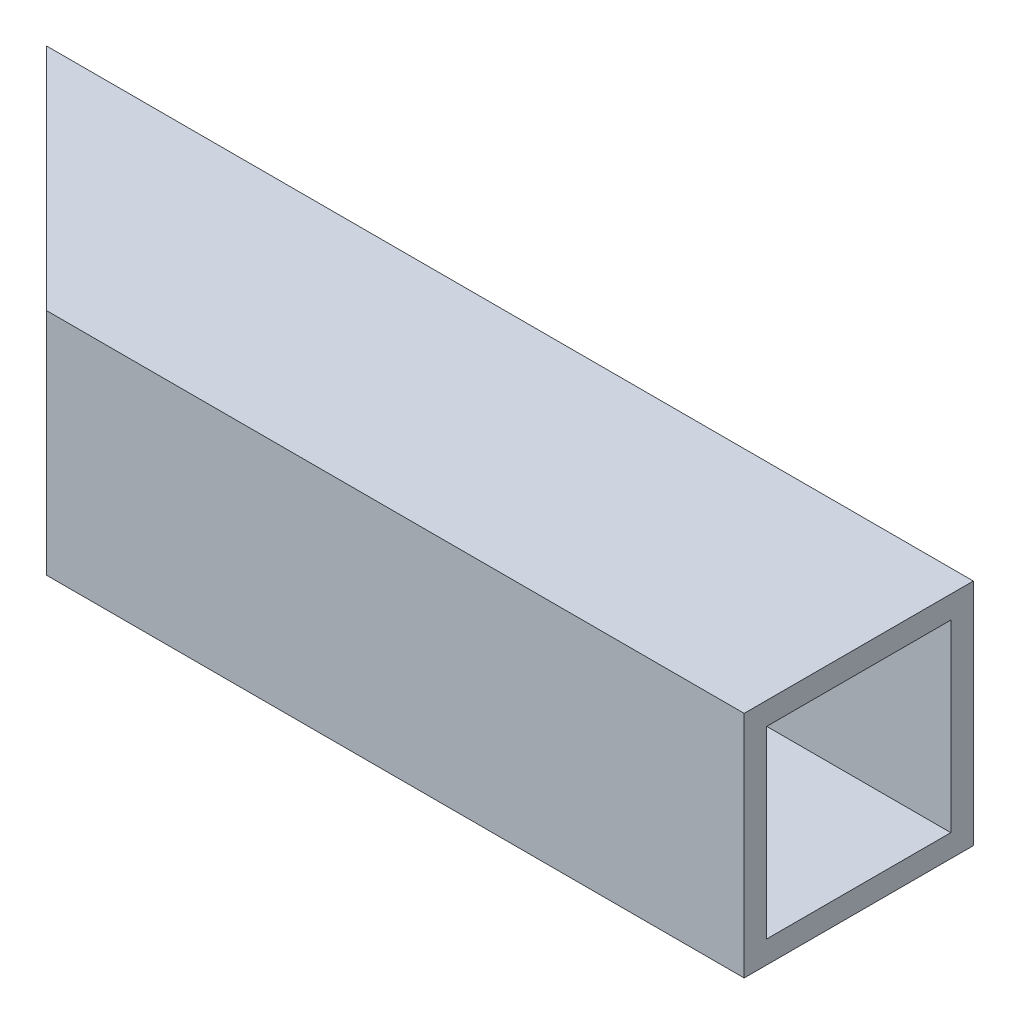
ISO-10303-21;
HEADER;
FILE_DESCRIPTION(('STEP AP214'),'2;1');
FILE_NAME('part.step','',(''),(''),'','','');
FILE_SCHEMA(('AUTOMOTIVE_DESIGN { 1 0 10303 214 1 1 1 1 }'));
ENDSEC;
DATA;
#1=APPLICATION_CONTEXT('core data for automotive mechanical design processes');
#2=APPLICATION_PROTOCOL_DEFINITION('international standard','automotive_design',2000,#1);
#3=PRODUCT_CONTEXT('',#1,'mechanical');
#4=PRODUCT('Part','Part','',(#3));
#5=PRODUCT_RELATED_PRODUCT_CATEGORY('part','',(#4));
#6=PRODUCT_DEFINITION_FORMATION('','',#4);
#7=PRODUCT_DEFINITION_CONTEXT('part definition',#1,'design');
#8=PRODUCT_DEFINITION('design','',#6,#7);
#9=PRODUCT_DEFINITION_SHAPE('','',#8);
#10=(LENGTH_UNIT() NAMED_UNIT(*) SI_UNIT(.MILLI.,.METRE.));
#11=(NAMED_UNIT(*) PLANE_ANGLE_UNIT() SI_UNIT($,.RADIAN.));
#12=(NAMED_UNIT(*) SI_UNIT($,.STERADIAN.) SOLID_ANGLE_UNIT());
#13=UNCERTAINTY_MEASURE_WITH_UNIT(LENGTH_MEASURE(1.E-05),#10,'distance_accuracy_value','');
#14=(GEOMETRIC_REPRESENTATION_CONTEXT(3) GLOBAL_UNCERTAINTY_ASSIGNED_CONTEXT((#13)) GLOBAL_UNIT_ASSIGNED_CONTEXT((#10,
#11,#12)) REPRESENTATION_CONTEXT('',''));
#15=CARTESIAN_POINT('',(0.,0.,0.));
#16=DIRECTION('',(0.,0.,1.));
#17=DIRECTION('',(1.,0.,0.));
#18=AXIS2_PLACEMENT_3D('',#15,#16,#17);
#19=CARTESIAN_POINT('',(102.7,0.,0.));
#20=DIRECTION('',(1.,0.,0.));
#21=DIRECTION('',(0.,0.,-1.));
#22=AXIS2_PLACEMENT_3D('',#19,#20,#21);
#23=PLANE('',#22);
#24=DIRECTION('',(0.,1.,0.));
#25=VECTOR('',#24,1.);
#26=CARTESIAN_POINT('',(102.7,12.7,-12.7));
#27=LINE('',#26,#25);
#28=CARTESIAN_POINT('',(102.7,-12.7,-12.7));
#29=VERTEX_POINT('',#28);
#30=CARTESIAN_POINT('',(102.7,12.7,-12.7));
#31=VERTEX_POINT('',#30);
#32=EDGE_CURVE('E148',#29,#31,#27,.T.);
#33=ORIENTED_EDGE('',*,*,#32,.T.);
#34=DIRECTION('',(0.,0.,1.));
#35=VECTOR('',#34,1.);
#36=CARTESIAN_POINT('',(102.7,12.7,12.7));
#37=LINE('',#36,#35);
#38=CARTESIAN_POINT('',(102.7,12.7,12.7));
#39=VERTEX_POINT('',#38);
#40=EDGE_CURVE('E143',#31,#39,#37,.T.);
#41=ORIENTED_EDGE('',*,*,#40,.T.);
#42=DIRECTION('',(0.,-1.,0.));
#43=VECTOR('',#42,1.);
#44=CARTESIAN_POINT('',(102.7,12.7,12.7));
#45=LINE('',#44,#43);
#46=CARTESIAN_POINT('',(102.7,-12.7,12.7));
#47=VERTEX_POINT('',#46);
#48=EDGE_CURVE('E159',#39,#47,#45,.T.);
#49=ORIENTED_EDGE('',*,*,#48,.T.);
#50=DIRECTION('',(0.,0.,-1.));
#51=VECTOR('',#50,1.);
#52=CARTESIAN_POINT('',(102.7,-12.7,12.7));
#53=LINE('',#52,#51);
#54=EDGE_CURVE('E129',#47,#29,#53,.T.);
#55=ORIENTED_EDGE('',*,*,#54,.T.);
#56=EDGE_LOOP('',(#33,#41,#49,#55));
#57=FACE_BOUND('',#56,.T.);
#58=DIRECTION('',(0.,0.,1.));
#59=VECTOR('',#58,1.);
#60=CARTESIAN_POINT('',(102.7,10.2,10.2));
#61=LINE('',#60,#59);
#62=CARTESIAN_POINT('',(102.7,10.2,-10.2));
#63=VERTEX_POINT('',#62);
#64=CARTESIAN_POINT('',(102.7,10.2,10.2));
#65=VERTEX_POINT('',#64);
#66=EDGE_CURVE('E179',#63,#65,#61,.T.);
#67=ORIENTED_EDGE('',*,*,#66,.F.);
#68=DIRECTION('',(0.,1.,0.));
#69=VECTOR('',#68,1.);
#70=CARTESIAN_POINT('',(102.7,10.2,-10.2));
#71=LINE('',#70,#69);
#72=CARTESIAN_POINT('',(102.7,-10.2,-10.2));
#73=VERTEX_POINT('',#72);
#74=EDGE_CURVE('E182',#73,#63,#71,.T.);
#75=ORIENTED_EDGE('',*,*,#74,.F.);
#76=DIRECTION('',(0.,0.,-1.));
#77=VECTOR('',#76,1.);
#78=CARTESIAN_POINT('',(102.7,-10.2,10.2));
#79=LINE('',#78,#77);
#80=CARTESIAN_POINT('',(102.7,-10.2,10.2));
#81=VERTEX_POINT('',#80);
#82=EDGE_CURVE('E173',#81,#73,#79,.T.);
#83=ORIENTED_EDGE('',*,*,#82,.F.);
#84=DIRECTION('',(0.,-1.,0.));
#85=VECTOR('',#84,1.);
#86=CARTESIAN_POINT('',(102.7,10.2,10.2));
#87=LINE('',#86,#85);
#88=EDGE_CURVE('E176',#65,#81,#87,.T.);
#89=ORIENTED_EDGE('',*,*,#88,.F.);
#90=EDGE_LOOP('',(#67,#75,#83,#89));
#91=FACE_BOUND('',#90,.T.);
#92=ADVANCED_FACE('F39',(#57,#91),#23,.T.);
#93=CARTESIAN_POINT('',(102.7,12.7,-12.7));
#94=DIRECTION('',(0.,0.,1.));
#95=DIRECTION('',(0.,-1.,0.));
#96=AXIS2_PLACEMENT_3D('',#93,#94,#95);
#97=PLANE('',#96);
#98=DIRECTION('',(0.,1.,0.));
#99=VECTOR('',#98,1.);
#100=CARTESIAN_POINT('',(0.,12.7,-12.7));
#101=LINE('',#100,#99);
#102=CARTESIAN_POINT('',(0.,-12.7,-12.7));
#103=VERTEX_POINT('',#102);
#104=CARTESIAN_POINT('',(0.,12.7,-12.7));
#105=VERTEX_POINT('',#104);
#106=EDGE_CURVE('E109',#103,#105,#101,.T.);
#107=ORIENTED_EDGE('',*,*,#106,.T.);
#108=DIRECTION('',(-1.,0.,0.));
#109=VECTOR('',#108,1.);
#110=CARTESIAN_POINT('',(102.7,12.7,-12.7));
#111=LINE('',#110,#109);
#112=EDGE_CURVE('E48',#31,#105,#111,.T.);
#113=ORIENTED_EDGE('',*,*,#112,.F.);
#114=ORIENTED_EDGE('',*,*,#32,.F.);
#115=DIRECTION('',(-1.,0.,0.));
#116=VECTOR('',#115,1.);
#117=CARTESIAN_POINT('',(102.7,-12.7,-12.7));
#118=LINE('',#117,#116);
#119=EDGE_CURVE('E131',#29,#103,#118,.T.);
#120=ORIENTED_EDGE('',*,*,#119,.T.);
#121=EDGE_LOOP('',(#107,#113,#114,#120));
#122=FACE_BOUND('',#121,.T.);
#123=ADVANCED_FACE('F41',(#122),#97,.F.);
#124=CARTESIAN_POINT('',(102.7,12.7,12.7));
#125=DIRECTION('',(0.,-1.,0.));
#126=DIRECTION('',(0.,0.,-1.));
#127=AXIS2_PLACEMENT_3D('',#124,#125,#126);
#128=PLANE('',#127);
#129=ORIENTED_EDGE('',*,*,#112,.T.);
#130=DIRECTION('',(-0.707106781186544,0.,-0.707106781186551));
#131=VECTOR('',#130,1.);
#132=CARTESIAN_POINT('',(0.,12.7,-12.7));
#133=LINE('',#132,#131);
#134=CARTESIAN_POINT('',(25.3999999999997,12.7,12.7));
#135=VERTEX_POINT('',#134);
#136=EDGE_CURVE('E115',#135,#105,#133,.T.);
#137=ORIENTED_EDGE('',*,*,#136,.F.);
#138=DIRECTION('',(-1.,0.,0.));
#139=VECTOR('',#138,1.);
#140=CARTESIAN_POINT('',(102.7,12.7,12.7));
#141=LINE('',#140,#139);
#142=EDGE_CURVE('E125',#39,#135,#141,.T.);
#143=ORIENTED_EDGE('',*,*,#142,.F.);
#144=ORIENTED_EDGE('',*,*,#40,.F.);
#145=EDGE_LOOP('',(#129,#137,#143,#144));
#146=FACE_BOUND('',#145,.T.);
#147=ADVANCED_FACE('F142',(#146),#128,.F.);
#148=CARTESIAN_POINT('',(102.7,12.7,12.7));
#149=DIRECTION('',(0.,0.,-1.));
#150=DIRECTION('',(0.,1.,0.));
#151=AXIS2_PLACEMENT_3D('',#148,#149,#150);
#152=PLANE('',#151);
#153=ORIENTED_EDGE('',*,*,#142,.T.);
#154=DIRECTION('',(0.,1.,0.));
#155=VECTOR('',#154,1.);
#156=CARTESIAN_POINT('',(25.3999999999997,-12.7,12.7));
#157=LINE('',#156,#155);
#158=CARTESIAN_POINT('',(25.3999999999997,-12.7,12.7));
#159=VERTEX_POINT('',#158);
#160=EDGE_CURVE('E106',#159,#135,#157,.T.);
#161=ORIENTED_EDGE('',*,*,#160,.F.);
#162=DIRECTION('',(-1.,0.,0.));
#163=VECTOR('',#162,1.);
#164=CARTESIAN_POINT('',(102.7,-12.7,12.7));
#165=LINE('',#164,#163);
#166=EDGE_CURVE('E122',#47,#159,#165,.T.);
#167=ORIENTED_EDGE('',*,*,#166,.F.);
#168=ORIENTED_EDGE('',*,*,#48,.F.);
#169=EDGE_LOOP('',(#153,#161,#167,#168));
#170=FACE_BOUND('',#169,.T.);
#171=ADVANCED_FACE('F120',(#170),#152,.F.);
#172=CARTESIAN_POINT('',(102.7,-12.7,12.7));
#173=DIRECTION('',(0.,1.,0.));
#174=DIRECTION('',(0.,0.,1.));
#175=AXIS2_PLACEMENT_3D('',#172,#173,#174);
#176=PLANE('',#175);
#177=ORIENTED_EDGE('',*,*,#166,.T.);
#178=DIRECTION('',(-0.707106781186544,0.,-0.707106781186551));
#179=VECTOR('',#178,1.);
#180=CARTESIAN_POINT('',(0.,-12.7,-12.7));
#181=LINE('',#180,#179);
#182=EDGE_CURVE('E103',#159,#103,#181,.T.);
#183=ORIENTED_EDGE('',*,*,#182,.T.);
#184=ORIENTED_EDGE('',*,*,#119,.F.);
#185=ORIENTED_EDGE('',*,*,#54,.F.);
#186=EDGE_LOOP('',(#177,#183,#184,#185));
#187=FACE_BOUND('',#186,.T.);
#188=ADVANCED_FACE('F128',(#187),#176,.F.);
#189=CARTESIAN_POINT('',(102.7,10.2,-10.2));
#190=DIRECTION('',(0.,0.,1.));
#191=DIRECTION('',(0.,-1.,0.));
#192=AXIS2_PLACEMENT_3D('',#189,#190,#191);
#193=PLANE('',#192);
#194=DIRECTION('',(0.,1.,0.));
#195=VECTOR('',#194,1.);
#196=CARTESIAN_POINT('',(2.49999999999999,10.2,-10.2));
#197=LINE('',#196,#195);
#198=CARTESIAN_POINT('',(2.49999999999998,-10.2,-10.2));
#199=VERTEX_POINT('',#198);
#200=CARTESIAN_POINT('',(2.49999999999999,10.2,-10.2));
#201=VERTEX_POINT('',#200);
#202=EDGE_CURVE('E185',#199,#201,#197,.T.);
#203=ORIENTED_EDGE('',*,*,#202,.F.);
#204=DIRECTION('',(-1.,0.,0.));
#205=VECTOR('',#204,1.);
#206=CARTESIAN_POINT('',(102.7,-10.2,-10.2));
#207=LINE('',#206,#205);
#208=EDGE_CURVE('E169',#73,#199,#207,.T.);
#209=ORIENTED_EDGE('',*,*,#208,.F.);
#210=ORIENTED_EDGE('',*,*,#74,.T.);
#211=DIRECTION('',(-1.,0.,0.));
#212=VECTOR('',#211,1.);
#213=CARTESIAN_POINT('',(102.7,10.2,-10.2));
#214=LINE('',#213,#212);
#215=EDGE_CURVE('E149',#63,#201,#214,.T.);
#216=ORIENTED_EDGE('',*,*,#215,.T.);
#217=EDGE_LOOP('',(#203,#209,#210,#216));
#218=FACE_BOUND('',#217,.T.);
#219=ADVANCED_FACE('F210',(#218),#193,.T.);
#220=CARTESIAN_POINT('',(102.7,10.2,10.2));
#221=DIRECTION('',(0.,-1.,0.));
#222=DIRECTION('',(0.,0.,-1.));
#223=AXIS2_PLACEMENT_3D('',#220,#221,#222);
#224=PLANE('',#223);
#225=DIRECTION('',(0.707106781186544,0.,0.707106781186551));
#226=VECTOR('',#225,1.);
#227=CARTESIAN_POINT('',(62.7999999999995,10.2,50.1000000000001));
#228=LINE('',#227,#226);
#229=CARTESIAN_POINT('',(22.8999999999998,10.2,10.2));
#230=VERTEX_POINT('',#229);
#231=EDGE_CURVE('E188',#201,#230,#228,.T.);
#232=ORIENTED_EDGE('',*,*,#231,.F.);
#233=ORIENTED_EDGE('',*,*,#215,.F.);
#234=ORIENTED_EDGE('',*,*,#66,.T.);
#235=DIRECTION('',(-1.,0.,0.));
#236=VECTOR('',#235,1.);
#237=CARTESIAN_POINT('',(102.7,10.2,10.2));
#238=LINE('',#237,#236);
#239=EDGE_CURVE('E154',#65,#230,#238,.T.);
#240=ORIENTED_EDGE('',*,*,#239,.T.);
#241=EDGE_LOOP('',(#232,#233,#234,#240));
#242=FACE_BOUND('',#241,.T.);
#243=ADVANCED_FACE('F202',(#242),#224,.T.);
#244=CARTESIAN_POINT('',(102.7,10.2,10.2));
#245=DIRECTION('',(0.,0.,-1.));
#246=DIRECTION('',(0.,1.,0.));
#247=AXIS2_PLACEMENT_3D('',#244,#245,#246);
#248=PLANE('',#247);
#249=DIRECTION('',(0.,-1.,0.));
#250=VECTOR('',#249,1.);
#251=CARTESIAN_POINT('',(22.8999999999998,10.2,10.2));
#252=LINE('',#251,#250);
#253=CARTESIAN_POINT('',(22.8999999999998,-10.2,10.2));
#254=VERTEX_POINT('',#253);
#255=EDGE_CURVE('E54',#230,#254,#252,.T.);
#256=ORIENTED_EDGE('',*,*,#255,.F.);
#257=ORIENTED_EDGE('',*,*,#239,.F.);
#258=ORIENTED_EDGE('',*,*,#88,.T.);
#259=DIRECTION('',(-1.,0.,0.));
#260=VECTOR('',#259,1.);
#261=CARTESIAN_POINT('',(102.7,-10.2,10.2));
#262=LINE('',#261,#260);
#263=EDGE_CURVE('E61',#81,#254,#262,.T.);
#264=ORIENTED_EDGE('',*,*,#263,.T.);
#265=EDGE_LOOP('',(#256,#257,#258,#264));
#266=FACE_BOUND('',#265,.T.);
#267=ADVANCED_FACE('F200',(#266),#248,.T.);
#268=CARTESIAN_POINT('',(102.7,-10.2,10.2));
#269=DIRECTION('',(0.,1.,0.));
#270=DIRECTION('',(0.,0.,1.));
#271=AXIS2_PLACEMENT_3D('',#268,#269,#270);
#272=PLANE('',#271);
#273=DIRECTION('',(-0.707106781186544,0.,-0.707106781186551));
#274=VECTOR('',#273,1.);
#275=CARTESIAN_POINT('',(62.7999999999995,-10.2,50.1000000000001));
#276=LINE('',#275,#274);
#277=EDGE_CURVE('E11',#254,#199,#276,.T.);
#278=ORIENTED_EDGE('',*,*,#277,.F.);
#279=ORIENTED_EDGE('',*,*,#263,.F.);
#280=ORIENTED_EDGE('',*,*,#82,.T.);
#281=ORIENTED_EDGE('',*,*,#208,.T.);
#282=EDGE_LOOP('',(#278,#279,#280,#281));
#283=FACE_BOUND('',#282,.T.);
#284=ADVANCED_FACE('F208',(#283),#272,.T.);
#285=CARTESIAN_POINT('',(0.,-12.7,-12.7));
#286=DIRECTION('',(0.707106781186551,0.,-0.707106781186544));
#287=DIRECTION('',(-0.707106781186544,0.,-0.707106781186551));
#288=AXIS2_PLACEMENT_3D('',#285,#286,#287);
#289=PLANE('',#288);
#290=ORIENTED_EDGE('',*,*,#202,.T.);
#291=ORIENTED_EDGE('',*,*,#231,.T.);
#292=ORIENTED_EDGE('',*,*,#255,.T.);
#293=ORIENTED_EDGE('',*,*,#277,.T.);
#294=EDGE_LOOP('',(#290,#291,#292,#293));
#295=FACE_BOUND('',#294,.T.);
#296=ORIENTED_EDGE('',*,*,#136,.T.);
#297=ORIENTED_EDGE('',*,*,#106,.F.);
#298=ORIENTED_EDGE('',*,*,#182,.F.);
#299=ORIENTED_EDGE('',*,*,#160,.T.);
#300=EDGE_LOOP('',(#296,#297,#298,#299));
#301=FACE_BOUND('',#300,.T.);
#302=ADVANCED_FACE('F105',(#295,#301),#289,.F.);
#303=CLOSED_SHELL('',(#92,#123,#147,#171,#188,#219,#243,#267,#284,#302));
#304=MANIFOLD_SOLID_BREP('B2',#303);
#305=ADVANCED_BREP_SHAPE_REPRESENTATION('',(#18,#304),#14);
#306=SHAPE_DEFINITION_REPRESENTATION(#9,#305);
ENDSEC;
END-ISO-10303-21;
